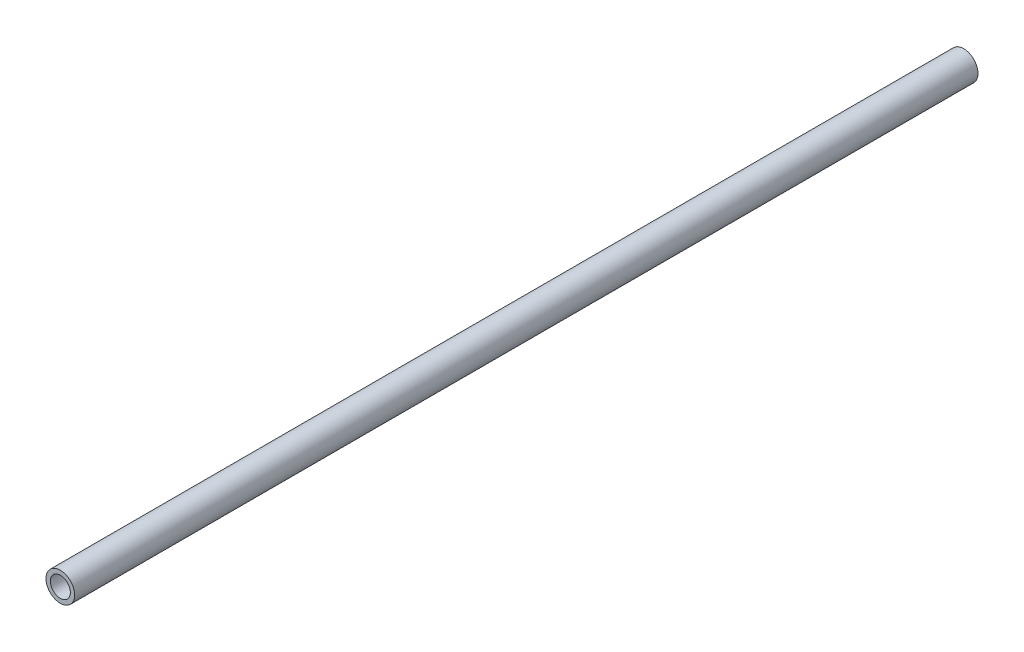
ISO-10303-21;
HEADER;
FILE_DESCRIPTION(('STEP AP214'),'2;1');
FILE_NAME('part.step','',(''),(''),'','','');
FILE_SCHEMA(('AUTOMOTIVE_DESIGN { 1 0 10303 214 1 1 1 1 }'));
ENDSEC;
DATA;
#1=APPLICATION_CONTEXT('core data for automotive mechanical design processes');
#2=APPLICATION_PROTOCOL_DEFINITION('international standard','automotive_design',2000,#1);
#3=PRODUCT_CONTEXT('',#1,'mechanical');
#4=PRODUCT('Part','Part','',(#3));
#5=PRODUCT_RELATED_PRODUCT_CATEGORY('part','',(#4));
#6=PRODUCT_DEFINITION_FORMATION('','',#4);
#7=PRODUCT_DEFINITION_CONTEXT('part definition',#1,'design');
#8=PRODUCT_DEFINITION('design','',#6,#7);
#9=PRODUCT_DEFINITION_SHAPE('','',#8);
#10=(LENGTH_UNIT() NAMED_UNIT(*) SI_UNIT(.MILLI.,.METRE.));
#11=(NAMED_UNIT(*) PLANE_ANGLE_UNIT() SI_UNIT($,.RADIAN.));
#12=(NAMED_UNIT(*) SI_UNIT($,.STERADIAN.) SOLID_ANGLE_UNIT());
#13=UNCERTAINTY_MEASURE_WITH_UNIT(LENGTH_MEASURE(1.E-05),#10,'distance_accuracy_value','');
#14=(GEOMETRIC_REPRESENTATION_CONTEXT(3) GLOBAL_UNCERTAINTY_ASSIGNED_CONTEXT((#13)) GLOBAL_UNIT_ASSIGNED_CONTEXT((#10,
#11,#12)) REPRESENTATION_CONTEXT('',''));
#15=CARTESIAN_POINT('',(0.,0.,0.));
#16=DIRECTION('',(0.,0.,1.));
#17=DIRECTION('',(1.,0.,0.));
#18=AXIS2_PLACEMENT_3D('',#15,#16,#17);
#19=CARTESIAN_POINT('',(0.,0.,1000.));
#20=DIRECTION('',(0.,0.,1.));
#21=DIRECTION('',(1.,0.,0.));
#22=AXIS2_PLACEMENT_3D('',#19,#20,#21);
#23=PLANE('',#22);
#24=CARTESIAN_POINT('',(0.,0.,1000.));
#25=DIRECTION('',(0.,0.,1.));
#26=DIRECTION('',(1.,0.,0.));
#27=AXIS2_PLACEMENT_3D('',#24,#25,#26);
#28=CIRCLE('',#27,15.875);
#29=CARTESIAN_POINT('',(15.875,0.,1000.));
#30=VERTEX_POINT('',#29);
#31=EDGE_CURVE('E10',#30,#30,#28,.T.);
#32=ORIENTED_EDGE('',*,*,#31,.T.);
#33=EDGE_LOOP('',(#32));
#34=FACE_BOUND('',#33,.T.);
#35=CARTESIAN_POINT('',(0.,0.,1000.));
#36=DIRECTION('',(0.,0.,1.));
#37=DIRECTION('',(1.,0.,0.));
#38=AXIS2_PLACEMENT_3D('',#35,#36,#37);
#39=CIRCLE('',#38,11.1);
#40=CARTESIAN_POINT('',(11.1,0.,1000.));
#41=VERTEX_POINT('',#40);
#42=EDGE_CURVE('E48',#41,#41,#39,.T.);
#43=ORIENTED_EDGE('',*,*,#42,.F.);
#44=EDGE_LOOP('',(#43));
#45=FACE_BOUND('',#44,.T.);
#46=ADVANCED_FACE('F37',(#34,#45),#23,.T.);
#47=CARTESIAN_POINT('',(0.,0.,0.));
#48=DIRECTION('',(0.,0.,1.));
#49=DIRECTION('',(1.,0.,0.));
#50=AXIS2_PLACEMENT_3D('',#47,#48,#49);
#51=PLANE('',#50);
#52=CARTESIAN_POINT('',(0.,0.,0.));
#53=DIRECTION('',(0.,0.,1.));
#54=DIRECTION('',(1.,0.,0.));
#55=AXIS2_PLACEMENT_3D('',#52,#53,#54);
#56=CIRCLE('',#55,15.875);
#57=CARTESIAN_POINT('',(15.875,0.,0.));
#58=VERTEX_POINT('',#57);
#59=EDGE_CURVE('E41',#58,#58,#56,.T.);
#60=ORIENTED_EDGE('',*,*,#59,.F.);
#61=EDGE_LOOP('',(#60));
#62=FACE_BOUND('',#61,.T.);
#63=CARTESIAN_POINT('',(0.,0.,0.));
#64=DIRECTION('',(0.,0.,1.));
#65=DIRECTION('',(1.,0.,0.));
#66=AXIS2_PLACEMENT_3D('',#63,#64,#65);
#67=CIRCLE('',#66,11.1);
#68=CARTESIAN_POINT('',(11.1,0.,0.));
#69=VERTEX_POINT('',#68);
#70=EDGE_CURVE('E50',#69,#69,#67,.T.);
#71=ORIENTED_EDGE('',*,*,#70,.T.);
#72=EDGE_LOOP('',(#71));
#73=FACE_BOUND('',#72,.T.);
#74=ADVANCED_FACE('F60',(#62,#73),#51,.F.);
#75=CARTESIAN_POINT('',(0.,0.,1000.));
#76=DIRECTION('',(0.,0.,-1.));
#77=DIRECTION('',(-1.,0.,0.));
#78=AXIS2_PLACEMENT_3D('',#75,#76,#77);
#79=CYLINDRICAL_SURFACE('',#78,15.875);
#80=ORIENTED_EDGE('',*,*,#31,.F.);
#81=EDGE_LOOP('',(#80));
#82=FACE_BOUND('',#81,.T.);
#83=ORIENTED_EDGE('',*,*,#59,.T.);
#84=EDGE_LOOP('',(#83));
#85=FACE_BOUND('',#84,.T.);
#86=ADVANCED_FACE('F39',(#82,#85),#79,.T.);
#87=CARTESIAN_POINT('',(0.,0.,1000.));
#88=DIRECTION('',(0.,0.,-1.));
#89=DIRECTION('',(-1.,0.,0.));
#90=AXIS2_PLACEMENT_3D('',#87,#88,#89);
#91=CYLINDRICAL_SURFACE('',#90,11.1);
#92=ORIENTED_EDGE('',*,*,#42,.T.);
#93=EDGE_LOOP('',(#92));
#94=FACE_BOUND('',#93,.T.);
#95=ORIENTED_EDGE('',*,*,#70,.F.);
#96=EDGE_LOOP('',(#95));
#97=FACE_BOUND('',#96,.T.);
#98=ADVANCED_FACE('F56',(#94,#97),#91,.F.);
#99=CLOSED_SHELL('',(#46,#74,#86,#98));
#100=MANIFOLD_SOLID_BREP('B2',#99);
#101=ADVANCED_BREP_SHAPE_REPRESENTATION('',(#18,#100),#14);
#102=SHAPE_DEFINITION_REPRESENTATION(#9,#101);
ENDSEC;
END-ISO-10303-21;
